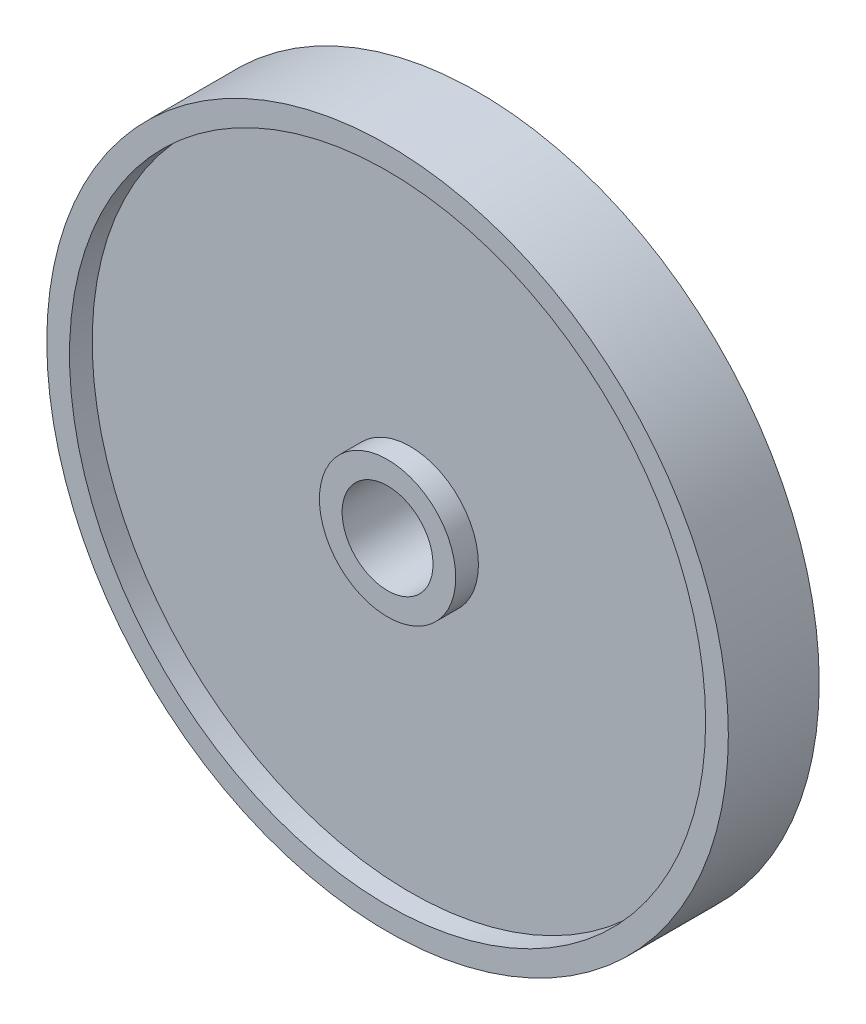
ISO-10303-21;
HEADER;
FILE_DESCRIPTION(('STEP AP214'),'2;1');
FILE_NAME('part.step','',(''),(''),'','','');
FILE_SCHEMA(('AUTOMOTIVE_DESIGN { 1 0 10303 214 1 1 1 1 }'));
ENDSEC;
DATA;
#1=APPLICATION_CONTEXT('core data for automotive mechanical design processes');
#2=APPLICATION_PROTOCOL_DEFINITION('international standard','automotive_design',2000,#1);
#3=PRODUCT_CONTEXT('',#1,'mechanical');
#4=PRODUCT('Part','Part','',(#3));
#5=PRODUCT_RELATED_PRODUCT_CATEGORY('part','',(#4));
#6=PRODUCT_DEFINITION_FORMATION('','',#4);
#7=PRODUCT_DEFINITION_CONTEXT('part definition',#1,'design');
#8=PRODUCT_DEFINITION('design','',#6,#7);
#9=PRODUCT_DEFINITION_SHAPE('','',#8);
#10=(LENGTH_UNIT() NAMED_UNIT(*) SI_UNIT(.MILLI.,.METRE.));
#11=(NAMED_UNIT(*) PLANE_ANGLE_UNIT() SI_UNIT($,.RADIAN.));
#12=(NAMED_UNIT(*) SI_UNIT($,.STERADIAN.) SOLID_ANGLE_UNIT());
#13=UNCERTAINTY_MEASURE_WITH_UNIT(LENGTH_MEASURE(1.E-05),#10,'distance_accuracy_value','');
#14=(GEOMETRIC_REPRESENTATION_CONTEXT(3) GLOBAL_UNCERTAINTY_ASSIGNED_CONTEXT((#13)) GLOBAL_UNIT_ASSIGNED_CONTEXT((#10,
#11,#12)) REPRESENTATION_CONTEXT('',''));
#15=CARTESIAN_POINT('',(0.,0.,0.));
#16=DIRECTION('',(0.,0.,1.));
#17=DIRECTION('',(1.,0.,0.));
#18=AXIS2_PLACEMENT_3D('',#15,#16,#17);
#19=CARTESIAN_POINT('',(0.,0.,0.));
#20=DIRECTION('',(0.,0.,1.));
#21=DIRECTION('',(1.,0.,0.));
#22=AXIS2_PLACEMENT_3D('',#19,#20,#21);
#23=PLANE('',#22);
#24=CARTESIAN_POINT('',(0.,0.,0.));
#25=DIRECTION('',(0.,0.,1.));
#26=DIRECTION('',(1.,0.,0.));
#27=AXIS2_PLACEMENT_3D('',#24,#25,#26);
#28=CIRCLE('',#27,5.);
#29=CARTESIAN_POINT('',(5.,0.,0.));
#30=VERTEX_POINT('',#29);
#31=EDGE_CURVE('E48',#30,#30,#28,.T.);
#32=ORIENTED_EDGE('',*,*,#31,.T.);
#33=EDGE_LOOP('',(#32));
#34=FACE_BOUND('',#33,.T.);
#35=CARTESIAN_POINT('',(0.,0.,0.));
#36=DIRECTION('',(0.,0.,-1.));
#37=DIRECTION('',(-1.,0.,0.));
#38=AXIS2_PLACEMENT_3D('',#35,#36,#37);
#39=CIRCLE('',#38,7.5);
#40=CARTESIAN_POINT('',(-7.5,0.,0.));
#41=VERTEX_POINT('',#40);
#42=EDGE_CURVE('E72',#41,#41,#39,.T.);
#43=ORIENTED_EDGE('',*,*,#42,.T.);
#44=EDGE_LOOP('',(#43));
#45=FACE_BOUND('',#44,.T.);
#46=ADVANCED_FACE('F35',(#34,#45),#23,.F.);
#47=CARTESIAN_POINT('',(0.,0.,10.));
#48=DIRECTION('',(0.,0.,1.));
#49=DIRECTION('',(1.,0.,0.));
#50=AXIS2_PLACEMENT_3D('',#47,#48,#49);
#51=PLANE('',#50);
#52=CARTESIAN_POINT('',(0.,0.,10.));
#53=DIRECTION('',(0.,0.,1.));
#54=DIRECTION('',(1.,0.,0.));
#55=AXIS2_PLACEMENT_3D('',#52,#53,#54);
#56=CIRCLE('',#55,5.);
#57=CARTESIAN_POINT('',(5.,0.,10.));
#58=VERTEX_POINT('',#57);
#59=EDGE_CURVE('E46',#58,#58,#56,.T.);
#60=ORIENTED_EDGE('',*,*,#59,.F.);
#61=EDGE_LOOP('',(#60));
#62=FACE_BOUND('',#61,.T.);
#63=CARTESIAN_POINT('',(0.,0.,10.));
#64=DIRECTION('',(0.,0.,1.));
#65=DIRECTION('',(1.,0.,0.));
#66=AXIS2_PLACEMENT_3D('',#63,#64,#65);
#67=CIRCLE('',#66,7.5);
#68=CARTESIAN_POINT('',(7.5,0.,10.));
#69=VERTEX_POINT('',#68);
#70=EDGE_CURVE('E60',#69,#69,#67,.T.);
#71=ORIENTED_EDGE('',*,*,#70,.T.);
#72=EDGE_LOOP('',(#71));
#73=FACE_BOUND('',#72,.T.);
#74=ADVANCED_FACE('F110',(#62,#73),#51,.T.);
#75=CARTESIAN_POINT('',(0.,0.,10.));
#76=DIRECTION('',(0.,0.,1.));
#77=DIRECTION('',(1.,0.,0.));
#78=AXIS2_PLACEMENT_3D('',#75,#76,#77);
#79=CIRCLE('',#78,35.);
#80=CARTESIAN_POINT('',(35.,0.,10.));
#81=VERTEX_POINT('',#80);
#82=EDGE_CURVE('E54',#81,#81,#79,.T.);
#83=ORIENTED_EDGE('',*,*,#82,.F.);
#84=EDGE_LOOP('',(#83));
#85=FACE_BOUND('',#84,.T.);
#86=CARTESIAN_POINT('',(0.,0.,10.));
#87=DIRECTION('',(0.,0.,1.));
#88=DIRECTION('',(1.,0.,0.));
#89=AXIS2_PLACEMENT_3D('',#86,#87,#88);
#90=CIRCLE('',#89,37.5);
#91=CARTESIAN_POINT('',(37.5,0.,10.));
#92=VERTEX_POINT('',#91);
#93=EDGE_CURVE('E10',#92,#92,#90,.T.);
#94=ORIENTED_EDGE('',*,*,#93,.T.);
#95=EDGE_LOOP('',(#94));
#96=FACE_BOUND('',#95,.T.);
#97=ADVANCED_FACE('F97',(#85,#96),#51,.T.);
#98=CARTESIAN_POINT('',(0.,0.,0.));
#99=DIRECTION('',(0.,0.,-1.));
#100=DIRECTION('',(-1.,0.,0.));
#101=AXIS2_PLACEMENT_3D('',#98,#99,#100);
#102=CIRCLE('',#101,35.);
#103=CARTESIAN_POINT('',(-35.,0.,0.));
#104=VERTEX_POINT('',#103);
#105=EDGE_CURVE('E66',#104,#104,#102,.T.);
#106=ORIENTED_EDGE('',*,*,#105,.F.);
#107=EDGE_LOOP('',(#106));
#108=FACE_BOUND('',#107,.T.);
#109=CARTESIAN_POINT('',(0.,0.,0.));
#110=DIRECTION('',(0.,0.,1.));
#111=DIRECTION('',(1.,0.,0.));
#112=AXIS2_PLACEMENT_3D('',#109,#110,#111);
#113=CIRCLE('',#112,37.5);
#114=CARTESIAN_POINT('',(37.5,0.,0.));
#115=VERTEX_POINT('',#114);
#116=EDGE_CURVE('E39',#115,#115,#113,.T.);
#117=ORIENTED_EDGE('',*,*,#116,.F.);
#118=EDGE_LOOP('',(#117));
#119=FACE_BOUND('',#118,.T.);
#120=ADVANCED_FACE('F94',(#108,#119),#23,.F.);
#121=CARTESIAN_POINT('',(0.,0.,10.));
#122=DIRECTION('',(0.,0.,-1.));
#123=DIRECTION('',(-1.,0.,0.));
#124=AXIS2_PLACEMENT_3D('',#121,#122,#123);
#125=CYLINDRICAL_SURFACE('',#124,37.5);
#126=ORIENTED_EDGE('',*,*,#93,.F.);
#127=EDGE_LOOP('',(#126));
#128=FACE_BOUND('',#127,.T.);
#129=ORIENTED_EDGE('',*,*,#116,.T.);
#130=EDGE_LOOP('',(#129));
#131=FACE_BOUND('',#130,.T.);
#132=ADVANCED_FACE('F37',(#128,#131),#125,.T.);
#133=CARTESIAN_POINT('',(0.,0.,10.));
#134=DIRECTION('',(0.,0.,-1.));
#135=DIRECTION('',(-1.,0.,0.));
#136=AXIS2_PLACEMENT_3D('',#133,#134,#135);
#137=CYLINDRICAL_SURFACE('',#136,5.);
#138=ORIENTED_EDGE('',*,*,#59,.T.);
#139=EDGE_LOOP('',(#138));
#140=FACE_BOUND('',#139,.T.);
#141=ORIENTED_EDGE('',*,*,#31,.F.);
#142=EDGE_LOOP('',(#141));
#143=FACE_BOUND('',#142,.T.);
#144=ADVANCED_FACE('F101',(#140,#143),#137,.F.);
#145=CARTESIAN_POINT('',(0.,0.,7.5));
#146=DIRECTION('',(0.,0.,1.));
#147=DIRECTION('',(1.,0.,0.));
#148=AXIS2_PLACEMENT_3D('',#145,#146,#147);
#149=CYLINDRICAL_SURFACE('',#148,35.);
#150=CARTESIAN_POINT('',(0.,0.,7.5));
#151=DIRECTION('',(0.,0.,1.));
#152=DIRECTION('',(1.,0.,0.));
#153=AXIS2_PLACEMENT_3D('',#150,#151,#152);
#154=CIRCLE('',#153,35.);
#155=CARTESIAN_POINT('',(35.,0.,7.5));
#156=VERTEX_POINT('',#155);
#157=EDGE_CURVE('E51',#156,#156,#154,.T.);
#158=ORIENTED_EDGE('',*,*,#157,.F.);
#159=EDGE_LOOP('',(#158));
#160=FACE_BOUND('',#159,.T.);
#161=ORIENTED_EDGE('',*,*,#82,.T.);
#162=EDGE_LOOP('',(#161));
#163=FACE_BOUND('',#162,.T.);
#164=ADVANCED_FACE('F106',(#160,#163),#149,.F.);
#165=CARTESIAN_POINT('',(0.,0.,7.5));
#166=DIRECTION('',(0.,0.,1.));
#167=DIRECTION('',(1.,0.,0.));
#168=AXIS2_PLACEMENT_3D('',#165,#166,#167);
#169=PLANE('',#168);
#170=CARTESIAN_POINT('',(0.,0.,7.5));
#171=DIRECTION('',(0.,0.,1.));
#172=DIRECTION('',(1.,0.,0.));
#173=AXIS2_PLACEMENT_3D('',#170,#171,#172);
#174=CIRCLE('',#173,7.5);
#175=CARTESIAN_POINT('',(7.5,0.,7.5));
#176=VERTEX_POINT('',#175);
#177=EDGE_CURVE('E57',#176,#176,#174,.T.);
#178=ORIENTED_EDGE('',*,*,#177,.F.);
#179=EDGE_LOOP('',(#178));
#180=FACE_BOUND('',#179,.T.);
#181=ORIENTED_EDGE('',*,*,#157,.T.);
#182=EDGE_LOOP('',(#181));
#183=FACE_BOUND('',#182,.T.);
#184=ADVANCED_FACE('F123',(#180,#183),#169,.T.);
#185=CARTESIAN_POINT('',(0.,0.,7.5));
#186=DIRECTION('',(0.,0.,1.));
#187=DIRECTION('',(1.,0.,0.));
#188=AXIS2_PLACEMENT_3D('',#185,#186,#187);
#189=CYLINDRICAL_SURFACE('',#188,7.5);
#190=ORIENTED_EDGE('',*,*,#177,.T.);
#191=EDGE_LOOP('',(#190));
#192=FACE_BOUND('',#191,.T.);
#193=ORIENTED_EDGE('',*,*,#70,.F.);
#194=EDGE_LOOP('',(#193));
#195=FACE_BOUND('',#194,.T.);
#196=ADVANCED_FACE('F90',(#192,#195),#189,.T.);
#197=CARTESIAN_POINT('',(0.,0.,2.5));
#198=DIRECTION('',(0.,0.,-1.));
#199=DIRECTION('',(-1.,0.,0.));
#200=AXIS2_PLACEMENT_3D('',#197,#198,#199);
#201=CYLINDRICAL_SURFACE('',#200,35.);
#202=CARTESIAN_POINT('',(0.,0.,2.5));
#203=DIRECTION('',(0.,0.,-1.));
#204=DIRECTION('',(-1.,0.,0.));
#205=AXIS2_PLACEMENT_3D('',#202,#203,#204);
#206=CIRCLE('',#205,35.);
#207=CARTESIAN_POINT('',(-35.,0.,2.5));
#208=VERTEX_POINT('',#207);
#209=EDGE_CURVE('E63',#208,#208,#206,.T.);
#210=ORIENTED_EDGE('',*,*,#209,.F.);
#211=EDGE_LOOP('',(#210));
#212=FACE_BOUND('',#211,.T.);
#213=ORIENTED_EDGE('',*,*,#105,.T.);
#214=EDGE_LOOP('',(#213));
#215=FACE_BOUND('',#214,.T.);
#216=ADVANCED_FACE('F84',(#212,#215),#201,.F.);
#217=CARTESIAN_POINT('',(0.,0.,2.5));
#218=DIRECTION('',(0.,0.,-1.));
#219=DIRECTION('',(-1.,0.,0.));
#220=AXIS2_PLACEMENT_3D('',#217,#218,#219);
#221=PLANE('',#220);
#222=CARTESIAN_POINT('',(0.,0.,2.5));
#223=DIRECTION('',(0.,0.,-1.));
#224=DIRECTION('',(-1.,0.,0.));
#225=AXIS2_PLACEMENT_3D('',#222,#223,#224);
#226=CIRCLE('',#225,7.5);
#227=CARTESIAN_POINT('',(-7.5,0.,2.5));
#228=VERTEX_POINT('',#227);
#229=EDGE_CURVE('E69',#228,#228,#226,.T.);
#230=ORIENTED_EDGE('',*,*,#229,.F.);
#231=EDGE_LOOP('',(#230));
#232=FACE_BOUND('',#231,.T.);
#233=ORIENTED_EDGE('',*,*,#209,.T.);
#234=EDGE_LOOP('',(#233));
#235=FACE_BOUND('',#234,.T.);
#236=ADVANCED_FACE('F81',(#232,#235),#221,.T.);
#237=CARTESIAN_POINT('',(0.,0.,2.5));
#238=DIRECTION('',(0.,0.,-1.));
#239=DIRECTION('',(-1.,0.,0.));
#240=AXIS2_PLACEMENT_3D('',#237,#238,#239);
#241=CYLINDRICAL_SURFACE('',#240,7.5);
#242=ORIENTED_EDGE('',*,*,#229,.T.);
#243=EDGE_LOOP('',(#242));
#244=FACE_BOUND('',#243,.T.);
#245=ORIENTED_EDGE('',*,*,#42,.F.);
#246=EDGE_LOOP('',(#245));
#247=FACE_BOUND('',#246,.T.);
#248=ADVANCED_FACE('F78',(#244,#247),#241,.T.);
#249=CLOSED_SHELL('',(#46,#74,#97,#120,#132,#144,#164,#184,#196,#216,#236,#248));
#250=MANIFOLD_SOLID_BREP('B2',#249);
#251=ADVANCED_BREP_SHAPE_REPRESENTATION('',(#18,#250),#14);
#252=SHAPE_DEFINITION_REPRESENTATION(#9,#251);
ENDSEC;
END-ISO-10303-21;
